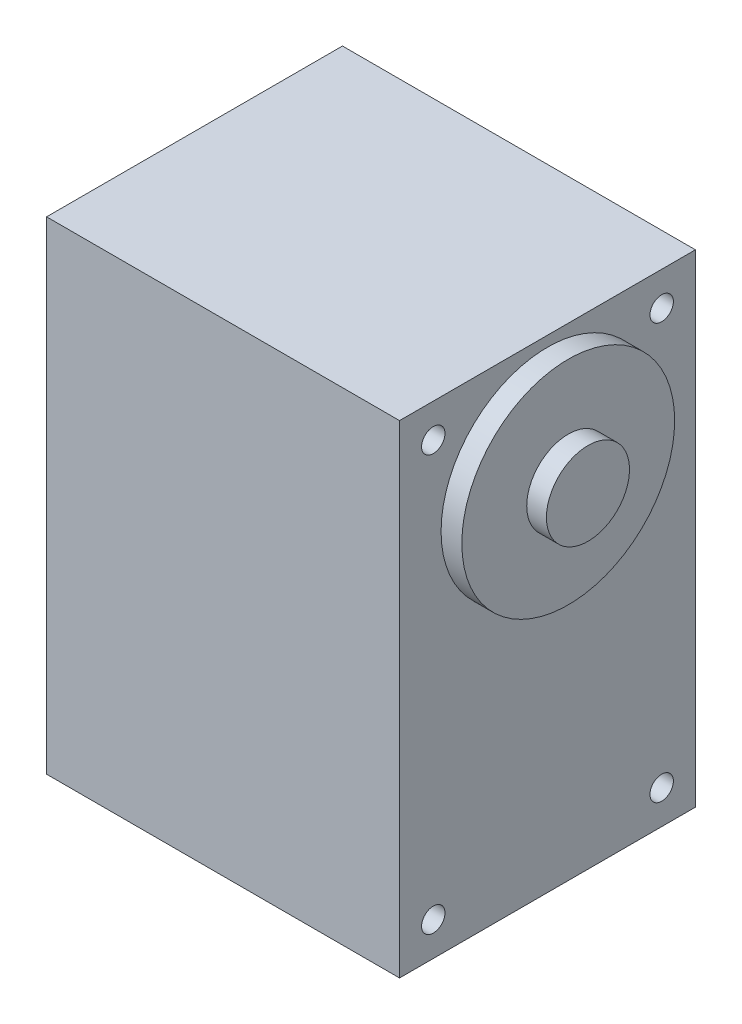
ISO-10303-21;
HEADER;
FILE_DESCRIPTION(('STEP AP214'),'2;1');
FILE_NAME('part.step','',(''),(''),'','','');
FILE_SCHEMA(('AUTOMOTIVE_DESIGN { 1 0 10303 214 1 1 1 1 }'));
ENDSEC;
DATA;
#1=APPLICATION_CONTEXT('core data for automotive mechanical design processes');
#2=APPLICATION_PROTOCOL_DEFINITION('international standard','automotive_design',2000,#1);
#3=PRODUCT_CONTEXT('',#1,'mechanical');
#4=PRODUCT('Part','Part','',(#3));
#5=PRODUCT_RELATED_PRODUCT_CATEGORY('part','',(#4));
#6=PRODUCT_DEFINITION_FORMATION('','',#4);
#7=PRODUCT_DEFINITION_CONTEXT('part definition',#1,'design');
#8=PRODUCT_DEFINITION('design','',#6,#7);
#9=PRODUCT_DEFINITION_SHAPE('','',#8);
#10=(LENGTH_UNIT() NAMED_UNIT(*) SI_UNIT(.MILLI.,.METRE.));
#11=(NAMED_UNIT(*) PLANE_ANGLE_UNIT() SI_UNIT($,.RADIAN.));
#12=(NAMED_UNIT(*) SI_UNIT($,.STERADIAN.) SOLID_ANGLE_UNIT());
#13=UNCERTAINTY_MEASURE_WITH_UNIT(LENGTH_MEASURE(1.E-05),#10,'distance_accuracy_value','');
#14=(GEOMETRIC_REPRESENTATION_CONTEXT(3) GLOBAL_UNCERTAINTY_ASSIGNED_CONTEXT((#13)) GLOBAL_UNIT_ASSIGNED_CONTEXT((#10,
#11,#12)) REPRESENTATION_CONTEXT('',''));
#15=CARTESIAN_POINT('',(0.,0.,0.));
#16=DIRECTION('',(0.,0.,1.));
#17=DIRECTION('',(1.,0.,0.));
#18=AXIS2_PLACEMENT_3D('',#15,#16,#17);
#19=CARTESIAN_POINT('',(17.,-23.25,28.5));
#20=DIRECTION('',(-1.,0.,0.));
#21=DIRECTION('',(0.,0.,1.));
#22=AXIS2_PLACEMENT_3D('',#19,#20,#21);
#23=PLANE('',#22);
#24=CARTESIAN_POINT('',(17.,-20.,3.24999999999958));
#25=DIRECTION('',(1.,0.,0.));
#26=DIRECTION('',(0.,0.,-1.));
#27=AXIS2_PLACEMENT_3D('',#24,#25,#26);
#28=CIRCLE('',#27,1.12689016254773);
#29=CARTESIAN_POINT('',(17.,-20.,2.12310983745185));
#30=VERTEX_POINT('',#29);
#31=EDGE_CURVE('E127',#30,#30,#28,.T.);
#32=ORIENTED_EDGE('',*,*,#31,.F.);
#33=EDGE_LOOP('',(#32));
#34=FACE_BOUND('',#33,.T.);
#35=CARTESIAN_POINT('',(17.,-20.0000000000002,25.2499999999995));
#36=DIRECTION('',(1.,0.,0.));
#37=DIRECTION('',(0.,0.,-1.));
#38=AXIS2_PLACEMENT_3D('',#35,#36,#37);
#39=CIRCLE('',#38,1.12689016254773);
#40=CARTESIAN_POINT('',(17.,-20.0000000000002,24.1231098374517));
#41=VERTEX_POINT('',#40);
#42=EDGE_CURVE('E134',#41,#41,#39,.T.);
#43=ORIENTED_EDGE('',*,*,#42,.F.);
#44=EDGE_LOOP('',(#43));
#45=FACE_BOUND('',#44,.T.);
#46=CARTESIAN_POINT('',(17.,19.9999999999999,25.2499999999999));
#47=DIRECTION('',(1.,0.,0.));
#48=DIRECTION('',(0.,0.,-1.));
#49=AXIS2_PLACEMENT_3D('',#46,#47,#48);
#50=CIRCLE('',#49,1.12689016254773);
#51=CARTESIAN_POINT('',(17.,19.9999999999999,24.1231098374522));
#52=VERTEX_POINT('',#51);
#53=EDGE_CURVE('E140',#52,#52,#50,.T.);
#54=ORIENTED_EDGE('',*,*,#53,.F.);
#55=EDGE_LOOP('',(#54));
#56=FACE_BOUND('',#55,.T.);
#57=CARTESIAN_POINT('',(17.,20.0000000000001,3.25));
#58=DIRECTION('',(1.,0.,0.));
#59=DIRECTION('',(0.,0.,-1.));
#60=AXIS2_PLACEMENT_3D('',#57,#58,#59);
#61=CIRCLE('',#60,1.12689016254773);
#62=CARTESIAN_POINT('',(17.,20.0000000000001,2.12310983745227));
#63=VERTEX_POINT('',#62);
#64=EDGE_CURVE('E121',#63,#63,#61,.T.);
#65=ORIENTED_EDGE('',*,*,#64,.F.);
#66=EDGE_LOOP('',(#65));
#67=FACE_BOUND('',#66,.T.);
#68=CARTESIAN_POINT('',(17.,12.,14.25));
#69=DIRECTION('',(1.,0.,0.));
#70=DIRECTION('',(0.,0.,-1.));
#71=AXIS2_PLACEMENT_3D('',#68,#69,#70);
#72=CIRCLE('',#71,10.25);
#73=CARTESIAN_POINT('',(17.,12.,4.));
#74=VERTEX_POINT('',#73);
#75=EDGE_CURVE('E41',#74,#74,#72,.T.);
#76=ORIENTED_EDGE('',*,*,#75,.F.);
#77=EDGE_LOOP('',(#76));
#78=FACE_BOUND('',#77,.T.);
#79=DIRECTION('',(0.,1.,0.));
#80=VECTOR('',#79,1.);
#81=CARTESIAN_POINT('',(17.,-23.25,0.));
#82=LINE('',#81,#80);
#83=CARTESIAN_POINT('',(17.,-23.25,0.));
#84=VERTEX_POINT('',#83);
#85=CARTESIAN_POINT('',(17.,23.25,0.));
#86=VERTEX_POINT('',#85);
#87=EDGE_CURVE('E99',#84,#86,#82,.T.);
#88=ORIENTED_EDGE('',*,*,#87,.T.);
#89=DIRECTION('',(0.,0.,-1.));
#90=VECTOR('',#89,1.);
#91=CARTESIAN_POINT('',(17.,23.25,28.5));
#92=LINE('',#91,#90);
#93=CARTESIAN_POINT('',(17.,23.25,28.5));
#94=VERTEX_POINT('',#93);
#95=EDGE_CURVE('E35',#94,#86,#92,.T.);
#96=ORIENTED_EDGE('',*,*,#95,.F.);
#97=DIRECTION('',(0.,1.,0.));
#98=VECTOR('',#97,1.);
#99=CARTESIAN_POINT('',(17.,-23.25,28.5));
#100=LINE('',#99,#98);
#101=CARTESIAN_POINT('',(17.,-23.25,28.5));
#102=VERTEX_POINT('',#101);
#103=EDGE_CURVE('E86',#102,#94,#100,.T.);
#104=ORIENTED_EDGE('',*,*,#103,.F.);
#105=DIRECTION('',(0.,0.,-1.));
#106=VECTOR('',#105,1.);
#107=CARTESIAN_POINT('',(17.,-23.25,28.5));
#108=LINE('',#107,#106);
#109=EDGE_CURVE('E95',#102,#84,#108,.T.);
#110=ORIENTED_EDGE('',*,*,#109,.T.);
#111=EDGE_LOOP('',(#88,#96,#104,#110));
#112=FACE_BOUND('',#111,.T.);
#113=ADVANCED_FACE('F32',(#34,#45,#56,#67,#78,#112),#23,.F.);
#114=CARTESIAN_POINT('',(-17.,23.25,28.5));
#115=DIRECTION('',(0.,-1.,0.));
#116=DIRECTION('',(0.,0.,-1.));
#117=AXIS2_PLACEMENT_3D('',#114,#115,#116);
#118=PLANE('',#117);
#119=DIRECTION('',(-1.,0.,0.));
#120=VECTOR('',#119,1.);
#121=CARTESIAN_POINT('',(-17.,23.25,0.));
#122=LINE('',#121,#120);
#123=CARTESIAN_POINT('',(-17.,23.25,0.));
#124=VERTEX_POINT('',#123);
#125=EDGE_CURVE('E91',#86,#124,#122,.T.);
#126=ORIENTED_EDGE('',*,*,#125,.T.);
#127=DIRECTION('',(0.,0.,-1.));
#128=VECTOR('',#127,1.);
#129=CARTESIAN_POINT('',(-17.,23.25,28.5));
#130=LINE('',#129,#128);
#131=CARTESIAN_POINT('',(-17.,23.25,28.5));
#132=VERTEX_POINT('',#131);
#133=EDGE_CURVE('E89',#132,#124,#130,.T.);
#134=ORIENTED_EDGE('',*,*,#133,.F.);
#135=DIRECTION('',(-1.,0.,0.));
#136=VECTOR('',#135,1.);
#137=CARTESIAN_POINT('',(-17.,23.25,28.5));
#138=LINE('',#137,#136);
#139=EDGE_CURVE('E81',#94,#132,#138,.T.);
#140=ORIENTED_EDGE('',*,*,#139,.F.);
#141=ORIENTED_EDGE('',*,*,#95,.T.);
#142=EDGE_LOOP('',(#126,#134,#140,#141));
#143=FACE_BOUND('',#142,.T.);
#144=ADVANCED_FACE('F90',(#143),#118,.F.);
#145=CARTESIAN_POINT('',(-17.,-23.25,28.5));
#146=DIRECTION('',(1.,0.,0.));
#147=DIRECTION('',(0.,0.,-1.));
#148=AXIS2_PLACEMENT_3D('',#145,#146,#147);
#149=PLANE('',#148);
#150=CARTESIAN_POINT('',(-17.,-20.,3.24999999999958));
#151=DIRECTION('',(1.,0.,0.));
#152=DIRECTION('',(0.,0.,-1.));
#153=AXIS2_PLACEMENT_3D('',#150,#151,#152);
#154=CIRCLE('',#153,1.12689016254773);
#155=CARTESIAN_POINT('',(-17.,-20.,2.12310983745185));
#156=VERTEX_POINT('',#155);
#157=EDGE_CURVE('E151',#156,#156,#154,.T.);
#158=ORIENTED_EDGE('',*,*,#157,.T.);
#159=EDGE_LOOP('',(#158));
#160=FACE_BOUND('',#159,.T.);
#161=CARTESIAN_POINT('',(-17.,-20.0000000000002,25.2499999999995));
#162=DIRECTION('',(1.,0.,0.));
#163=DIRECTION('',(0.,0.,-1.));
#164=AXIS2_PLACEMENT_3D('',#161,#162,#163);
#165=CIRCLE('',#164,1.12689016254773);
#166=CARTESIAN_POINT('',(-17.,-20.0000000000002,24.1231098374517));
#167=VERTEX_POINT('',#166);
#168=EDGE_CURVE('E157',#167,#167,#165,.T.);
#169=ORIENTED_EDGE('',*,*,#168,.T.);
#170=EDGE_LOOP('',(#169));
#171=FACE_BOUND('',#170,.T.);
#172=CARTESIAN_POINT('',(-17.,19.9999999999999,25.2499999999999));
#173=DIRECTION('',(1.,0.,0.));
#174=DIRECTION('',(0.,0.,-1.));
#175=AXIS2_PLACEMENT_3D('',#172,#173,#174);
#176=CIRCLE('',#175,1.12689016254773);
#177=CARTESIAN_POINT('',(-17.,19.9999999999999,24.1231098374522));
#178=VERTEX_POINT('',#177);
#179=EDGE_CURVE('E163',#178,#178,#176,.T.);
#180=ORIENTED_EDGE('',*,*,#179,.T.);
#181=EDGE_LOOP('',(#180));
#182=FACE_BOUND('',#181,.T.);
#183=CARTESIAN_POINT('',(-17.,20.0000000000001,3.25));
#184=DIRECTION('',(1.,0.,0.));
#185=DIRECTION('',(0.,0.,-1.));
#186=AXIS2_PLACEMENT_3D('',#183,#184,#185);
#187=CIRCLE('',#186,1.12689016254773);
#188=CARTESIAN_POINT('',(-17.,20.0000000000001,2.12310983745227));
#189=VERTEX_POINT('',#188);
#190=EDGE_CURVE('E145',#189,#189,#187,.T.);
#191=ORIENTED_EDGE('',*,*,#190,.T.);
#192=EDGE_LOOP('',(#191));
#193=FACE_BOUND('',#192,.T.);
#194=DIRECTION('',(0.,-1.,0.));
#195=VECTOR('',#194,1.);
#196=CARTESIAN_POINT('',(-17.,-23.25,0.));
#197=LINE('',#196,#195);
#198=CARTESIAN_POINT('',(-17.,-23.25,0.));
#199=VERTEX_POINT('',#198);
#200=EDGE_CURVE('E67',#124,#199,#197,.T.);
#201=ORIENTED_EDGE('',*,*,#200,.T.);
#202=DIRECTION('',(0.,0.,-1.));
#203=VECTOR('',#202,1.);
#204=CARTESIAN_POINT('',(-17.,-23.25,28.5));
#205=LINE('',#204,#203);
#206=CARTESIAN_POINT('',(-17.,-23.25,28.5));
#207=VERTEX_POINT('',#206);
#208=EDGE_CURVE('E92',#207,#199,#205,.T.);
#209=ORIENTED_EDGE('',*,*,#208,.F.);
#210=DIRECTION('',(0.,-1.,0.));
#211=VECTOR('',#210,1.);
#212=CARTESIAN_POINT('',(-17.,-23.25,28.5));
#213=LINE('',#212,#211);
#214=EDGE_CURVE('E84',#132,#207,#213,.T.);
#215=ORIENTED_EDGE('',*,*,#214,.F.);
#216=ORIENTED_EDGE('',*,*,#133,.T.);
#217=EDGE_LOOP('',(#201,#209,#215,#216));
#218=FACE_BOUND('',#217,.T.);
#219=ADVANCED_FACE('F93',(#160,#171,#182,#193,#218),#149,.F.);
#220=CARTESIAN_POINT('',(-17.,-23.25,28.5));
#221=DIRECTION('',(0.,1.,0.));
#222=DIRECTION('',(0.,0.,1.));
#223=AXIS2_PLACEMENT_3D('',#220,#221,#222);
#224=PLANE('',#223);
#225=DIRECTION('',(1.,0.,0.));
#226=VECTOR('',#225,1.);
#227=CARTESIAN_POINT('',(-17.,-23.25,0.));
#228=LINE('',#227,#226);
#229=EDGE_CURVE('E73',#199,#84,#228,.T.);
#230=ORIENTED_EDGE('',*,*,#229,.T.);
#231=ORIENTED_EDGE('',*,*,#109,.F.);
#232=DIRECTION('',(1.,0.,0.));
#233=VECTOR('',#232,1.);
#234=CARTESIAN_POINT('',(-17.,-23.25,28.5));
#235=LINE('',#234,#233);
#236=EDGE_CURVE('E50',#207,#102,#235,.T.);
#237=ORIENTED_EDGE('',*,*,#236,.F.);
#238=ORIENTED_EDGE('',*,*,#208,.T.);
#239=EDGE_LOOP('',(#230,#231,#237,#238));
#240=FACE_BOUND('',#239,.T.);
#241=ADVANCED_FACE('F107',(#240),#224,.F.);
#242=CARTESIAN_POINT('',(0.,0.,28.5));
#243=DIRECTION('',(0.,0.,-1.));
#244=DIRECTION('',(-1.,0.,0.));
#245=AXIS2_PLACEMENT_3D('',#242,#243,#244);
#246=PLANE('',#245);
#247=ORIENTED_EDGE('',*,*,#103,.T.);
#248=ORIENTED_EDGE('',*,*,#139,.T.);
#249=ORIENTED_EDGE('',*,*,#214,.T.);
#250=ORIENTED_EDGE('',*,*,#236,.T.);
#251=EDGE_LOOP('',(#247,#248,#249,#250));
#252=FACE_BOUND('',#251,.T.);
#253=ADVANCED_FACE('F82',(#252),#246,.F.);
#254=CARTESIAN_POINT('',(0.,0.,0.));
#255=DIRECTION('',(0.,0.,-1.));
#256=DIRECTION('',(-1.,0.,0.));
#257=AXIS2_PLACEMENT_3D('',#254,#255,#256);
#258=PLANE('',#257);
#259=ORIENTED_EDGE('',*,*,#87,.F.);
#260=ORIENTED_EDGE('',*,*,#229,.F.);
#261=ORIENTED_EDGE('',*,*,#200,.F.);
#262=ORIENTED_EDGE('',*,*,#125,.F.);
#263=EDGE_LOOP('',(#259,#260,#261,#262));
#264=FACE_BOUND('',#263,.T.);
#265=ADVANCED_FACE('F110',(#264),#258,.T.);
#266=CARTESIAN_POINT('',(19.,12.,14.25));
#267=DIRECTION('',(-1.,0.,0.));
#268=DIRECTION('',(0.,0.,1.));
#269=AXIS2_PLACEMENT_3D('',#266,#267,#268);
#270=CYLINDRICAL_SURFACE('',#269,10.25);
#271=CARTESIAN_POINT('',(19.,12.,14.25));
#272=DIRECTION('',(1.,0.,0.));
#273=DIRECTION('',(0.,0.,-1.));
#274=AXIS2_PLACEMENT_3D('',#271,#272,#273);
#275=CIRCLE('',#274,10.25);
#276=CARTESIAN_POINT('',(19.,12.,4.));
#277=VERTEX_POINT('',#276);
#278=EDGE_CURVE('E102',#277,#277,#275,.T.);
#279=ORIENTED_EDGE('',*,*,#278,.F.);
#280=EDGE_LOOP('',(#279));
#281=FACE_BOUND('',#280,.T.);
#282=ORIENTED_EDGE('',*,*,#75,.T.);
#283=EDGE_LOOP('',(#282));
#284=FACE_BOUND('',#283,.T.);
#285=ADVANCED_FACE('F200',(#281,#284),#270,.T.);
#286=CARTESIAN_POINT('',(19.,12.,14.25));
#287=DIRECTION('',(1.,0.,0.));
#288=DIRECTION('',(0.,0.,-1.));
#289=AXIS2_PLACEMENT_3D('',#286,#287,#288);
#290=PLANE('',#289);
#291=CARTESIAN_POINT('',(19.,12.,14.25));
#292=DIRECTION('',(1.,0.,0.));
#293=DIRECTION('',(0.,0.,-1.));
#294=AXIS2_PLACEMENT_3D('',#291,#292,#293);
#295=CIRCLE('',#294,4.);
#296=CARTESIAN_POINT('',(19.,12.,18.25));
#297=VERTEX_POINT('',#296);
#298=EDGE_CURVE('E11',#297,#297,#295,.T.);
#299=ORIENTED_EDGE('',*,*,#298,.F.);
#300=EDGE_LOOP('',(#299));
#301=FACE_BOUND('',#300,.T.);
#302=ORIENTED_EDGE('',*,*,#278,.T.);
#303=EDGE_LOOP('',(#302));
#304=FACE_BOUND('',#303,.T.);
#305=ADVANCED_FACE('F202',(#301,#304),#290,.T.);
#306=CARTESIAN_POINT('',(20.9,12.,14.25));
#307=DIRECTION('',(-1.,0.,0.));
#308=DIRECTION('',(0.,0.,1.));
#309=AXIS2_PLACEMENT_3D('',#306,#307,#308);
#310=CYLINDRICAL_SURFACE('',#309,4.);
#311=CARTESIAN_POINT('',(20.9,12.,14.25));
#312=DIRECTION('',(1.,0.,0.));
#313=DIRECTION('',(0.,0.,-1.));
#314=AXIS2_PLACEMENT_3D('',#311,#312,#313);
#315=CIRCLE('',#314,4.);
#316=CARTESIAN_POINT('',(20.9,12.,18.25));
#317=VERTEX_POINT('',#316);
#318=EDGE_CURVE('E116',#317,#317,#315,.T.);
#319=CARTESIAN_POINT('',(20.9,12.,18.25));
#320=CARTESIAN_POINT('',(20.8802083333333,12.,18.25));
#321=CARTESIAN_POINT('',(20.8604166666667,12.,18.25));
#322=CARTESIAN_POINT('',(20.8208333333333,12.,18.25));
#323=CARTESIAN_POINT('',(20.8010416666667,12.,18.25));
#324=CARTESIAN_POINT('',(20.7614583333333,12.,18.25));
#325=CARTESIAN_POINT('',(20.7416666666667,12.,18.25));
#326=CARTESIAN_POINT('',(20.7020833333333,12.,18.25));
#327=CARTESIAN_POINT('',(20.6822916666667,12.,18.25));
#328=CARTESIAN_POINT('',(20.6427083333333,12.,18.25));
#329=CARTESIAN_POINT('',(20.6229166666667,12.,18.25));
#330=CARTESIAN_POINT('',(20.5833333333333,12.,18.25));
#331=CARTESIAN_POINT('',(20.5635416666667,12.,18.25));
#332=CARTESIAN_POINT('',(20.5239583333333,12.,18.25));
#333=CARTESIAN_POINT('',(20.5041666666667,12.,18.25));
#334=CARTESIAN_POINT('',(20.4645833333333,12.,18.25));
#335=CARTESIAN_POINT('',(20.4447916666667,12.,18.25));
#336=CARTESIAN_POINT('',(20.4052083333333,12.,18.25));
#337=CARTESIAN_POINT('',(20.3854166666667,12.,18.25));
#338=CARTESIAN_POINT('',(20.3458333333333,12.,18.25));
#339=CARTESIAN_POINT('',(20.3260416666667,12.,18.25));
#340=CARTESIAN_POINT('',(20.2864583333333,12.,18.25));
#341=CARTESIAN_POINT('',(20.2666666666667,12.,18.25));
#342=CARTESIAN_POINT('',(20.2270833333333,12.,18.25));
#343=CARTESIAN_POINT('',(20.2072916666667,12.,18.25));
#344=CARTESIAN_POINT('',(20.1677083333333,12.,18.25));
#345=CARTESIAN_POINT('',(20.1479166666667,12.,18.25));
#346=CARTESIAN_POINT('',(20.1083333333333,12.,18.25));
#347=CARTESIAN_POINT('',(20.0885416666667,12.,18.25));
#348=CARTESIAN_POINT('',(20.0489583333333,12.,18.25));
#349=CARTESIAN_POINT('',(20.0291666666667,12.,18.25));
#350=CARTESIAN_POINT('',(19.9895833333333,12.,18.25));
#351=CARTESIAN_POINT('',(19.9697916666667,12.,18.25));
#352=CARTESIAN_POINT('',(19.9302083333333,12.,18.25));
#353=CARTESIAN_POINT('',(19.9104166666667,12.,18.25));
#354=CARTESIAN_POINT('',(19.8708333333333,12.,18.25));
#355=CARTESIAN_POINT('',(19.8510416666667,12.,18.25));
#356=CARTESIAN_POINT('',(19.8114583333333,12.,18.25));
#357=CARTESIAN_POINT('',(19.7916666666667,12.,18.25));
#358=CARTESIAN_POINT('',(19.7520833333333,12.,18.25));
#359=CARTESIAN_POINT('',(19.7322916666667,12.,18.25));
#360=CARTESIAN_POINT('',(19.6927083333333,12.,18.25));
#361=CARTESIAN_POINT('',(19.6729166666667,12.,18.25));
#362=CARTESIAN_POINT('',(19.6333333333333,12.,18.25));
#363=CARTESIAN_POINT('',(19.6135416666667,12.,18.25));
#364=CARTESIAN_POINT('',(19.5739583333333,12.,18.25));
#365=CARTESIAN_POINT('',(19.5541666666667,12.,18.25));
#366=CARTESIAN_POINT('',(19.5145833333333,12.,18.25));
#367=CARTESIAN_POINT('',(19.4947916666667,12.,18.25));
#368=CARTESIAN_POINT('',(19.4552083333333,12.,18.25));
#369=CARTESIAN_POINT('',(19.4354166666667,12.,18.25));
#370=CARTESIAN_POINT('',(19.3958333333333,12.,18.25));
#371=CARTESIAN_POINT('',(19.3760416666667,12.,18.25));
#372=CARTESIAN_POINT('',(19.3364583333333,12.,18.25));
#373=CARTESIAN_POINT('',(19.3166666666667,12.,18.25));
#374=CARTESIAN_POINT('',(19.2770833333333,12.,18.25));
#375=CARTESIAN_POINT('',(19.2572916666667,12.,18.25));
#376=CARTESIAN_POINT('',(19.2177083333333,12.,18.25));
#377=CARTESIAN_POINT('',(19.1979166666667,12.,18.25));
#378=CARTESIAN_POINT('',(19.1583333333333,12.,18.25));
#379=CARTESIAN_POINT('',(19.1385416666667,12.,18.25));
#380=CARTESIAN_POINT('',(19.0989583333333,12.,18.25));
#381=CARTESIAN_POINT('',(19.0791666666667,12.,18.25));
#382=CARTESIAN_POINT('',(19.0395833333333,12.,18.25));
#383=CARTESIAN_POINT('',(19.0197916666667,12.,18.25));
#384=CARTESIAN_POINT('',(19.,12.,18.25));
#385=B_SPLINE_CURVE_WITH_KNOTS('',3,(#319,#320,#321,#322,#323,#324,#325,#326,#327,#328,#329,
#330,#331,#332,#333,#334,#335,#336,#337,#338,#339,#340,#341,#342,#343,#344,#345,#346,#347,#348,
#349,#350,#351,#352,#353,#354,#355,#356,#357,#358,#359,#360,#361,#362,#363,#364,#365,#366,#367,
#368,#369,#370,#371,#372,#373,#374,#375,#376,#377,#378,#379,#380,#381,#382,#383,#384),
.UNSPECIFIED.,.F.,.F.,(4,2,2,2,2,2,2,2,2,2,2,2,2,2,2,2,2,2,2,2,2,2,2,2,2,2,2,2,2,2,2,2,4),(0.,
0.0593749999999969,0.118749999999997,0.178124999999998,0.237499999999998,0.296874999999999,
0.356249999999999,0.415624999999999,0.475,0.534374999999997,0.593749999999997,0.653124999999998,
0.712499999999998,0.771874999999998,0.831249999999999,0.890624999999999,0.95,1.009375,1.06875,
1.128125,1.1875,1.246875,1.30625,1.365625,1.425,1.484375,1.54375,1.603125,1.6625,1.721875,
1.78125,1.840625,1.9),.UNSPECIFIED.);
#386=EDGE_CURVE('BSEAM209',#317,#297,#385,.T.);
#387=ORIENTED_EDGE('',*,*,#318,.F.);
#388=ORIENTED_EDGE('',*,*,#298,.T.);
#389=ORIENTED_EDGE('',*,*,#386,.T.);
#390=ORIENTED_EDGE('',*,*,#386,.F.);
#391=EDGE_LOOP('',(#387,#389,#388,#390));
#392=FACE_BOUND('',#391,.T.);
#393=ADVANCED_FACE('F209',(#392),#310,.T.);
#394=CARTESIAN_POINT('',(20.9,12.,14.25));
#395=DIRECTION('',(1.,0.,0.));
#396=DIRECTION('',(0.,0.,-1.));
#397=AXIS2_PLACEMENT_3D('',#394,#395,#396);
#398=PLANE('',#397);
#399=ORIENTED_EDGE('',*,*,#318,.T.);
#400=EDGE_LOOP('',(#399));
#401=FACE_BOUND('',#400,.T.);
#402=ADVANCED_FACE('F274',(#401),#398,.T.);
#403=CARTESIAN_POINT('',(13.,20.0000000000001,3.25));
#404=DIRECTION('',(1.,0.,0.));
#405=DIRECTION('',(0.,0.,-1.));
#406=AXIS2_PLACEMENT_3D('',#403,#404,#405);
#407=CYLINDRICAL_SURFACE('',#406,1.12689016254773);
#408=CARTESIAN_POINT('',(13.,20.0000000000001,3.25));
#409=DIRECTION('',(1.,0.,0.));
#410=DIRECTION('',(0.,0.,-1.));
#411=AXIS2_PLACEMENT_3D('',#408,#409,#410);
#412=CIRCLE('',#411,1.12689016254773);
#413=CARTESIAN_POINT('',(13.,20.0000000000001,2.12310983745227));
#414=VERTEX_POINT('',#413);
#415=EDGE_CURVE('E120',#414,#414,#412,.T.);
#416=ORIENTED_EDGE('',*,*,#415,.F.);
#417=EDGE_LOOP('',(#416));
#418=FACE_BOUND('',#417,.T.);
#419=ORIENTED_EDGE('',*,*,#64,.T.);
#420=EDGE_LOOP('',(#419));
#421=FACE_BOUND('',#420,.T.);
#422=ADVANCED_FACE('F270',(#418,#421),#407,.F.);
#423=CARTESIAN_POINT('',(13.,20.0000000000001,3.25));
#424=DIRECTION('',(1.,0.,0.));
#425=DIRECTION('',(0.,0.,-1.));
#426=AXIS2_PLACEMENT_3D('',#423,#424,#425);
#427=PLANE('',#426);
#428=ORIENTED_EDGE('',*,*,#415,.T.);
#429=EDGE_LOOP('',(#428));
#430=FACE_BOUND('',#429,.T.);
#431=ADVANCED_FACE('F256',(#430),#427,.T.);
#432=CARTESIAN_POINT('',(13.,19.9999999999999,25.2499999999999));
#433=DIRECTION('',(1.,0.,0.));
#434=DIRECTION('',(0.,0.,-1.));
#435=AXIS2_PLACEMENT_3D('',#432,#433,#434);
#436=CYLINDRICAL_SURFACE('',#435,1.12689016254773);
#437=CARTESIAN_POINT('',(13.,19.9999999999999,25.2499999999999));
#438=DIRECTION('',(1.,0.,0.));
#439=DIRECTION('',(0.,0.,-1.));
#440=AXIS2_PLACEMENT_3D('',#437,#438,#439);
#441=CIRCLE('',#440,1.12689016254773);
#442=CARTESIAN_POINT('',(13.,19.9999999999999,24.1231098374522));
#443=VERTEX_POINT('',#442);
#444=EDGE_CURVE('E124',#443,#443,#441,.T.);
#445=ORIENTED_EDGE('',*,*,#444,.F.);
#446=EDGE_LOOP('',(#445));
#447=FACE_BOUND('',#446,.T.);
#448=ORIENTED_EDGE('',*,*,#53,.T.);
#449=EDGE_LOOP('',(#448));
#450=FACE_BOUND('',#449,.T.);
#451=ADVANCED_FACE('F252',(#447,#450),#436,.F.);
#452=CARTESIAN_POINT('',(13.,19.9999999999999,25.2499999999999));
#453=DIRECTION('',(1.,0.,0.));
#454=DIRECTION('',(0.,0.,-1.));
#455=AXIS2_PLACEMENT_3D('',#452,#453,#454);
#456=PLANE('',#455);
#457=ORIENTED_EDGE('',*,*,#444,.T.);
#458=EDGE_LOOP('',(#457));
#459=FACE_BOUND('',#458,.T.);
#460=ADVANCED_FACE('F248',(#459),#456,.T.);
#461=CARTESIAN_POINT('',(13.,-20.0000000000002,25.2499999999995));
#462=DIRECTION('',(1.,0.,0.));
#463=DIRECTION('',(0.,0.,-1.));
#464=AXIS2_PLACEMENT_3D('',#461,#462,#463);
#465=CYLINDRICAL_SURFACE('',#464,1.12689016254773);
#466=CARTESIAN_POINT('',(13.,-20.0000000000002,25.2499999999995));
#467=DIRECTION('',(1.,0.,0.));
#468=DIRECTION('',(0.,0.,-1.));
#469=AXIS2_PLACEMENT_3D('',#466,#467,#468);
#470=CIRCLE('',#469,1.12689016254773);
#471=CARTESIAN_POINT('',(13.,-20.0000000000002,24.1231098374517));
#472=VERTEX_POINT('',#471);
#473=EDGE_CURVE('E137',#472,#472,#470,.T.);
#474=ORIENTED_EDGE('',*,*,#473,.F.);
#475=EDGE_LOOP('',(#474));
#476=FACE_BOUND('',#475,.T.);
#477=ORIENTED_EDGE('',*,*,#42,.T.);
#478=EDGE_LOOP('',(#477));
#479=FACE_BOUND('',#478,.T.);
#480=ADVANCED_FACE('F251',(#476,#479),#465,.F.);
#481=CARTESIAN_POINT('',(13.,-20.0000000000002,25.2499999999995));
#482=DIRECTION('',(1.,0.,0.));
#483=DIRECTION('',(0.,0.,-1.));
#484=AXIS2_PLACEMENT_3D('',#481,#482,#483);
#485=PLANE('',#484);
#486=ORIENTED_EDGE('',*,*,#473,.T.);
#487=EDGE_LOOP('',(#486));
#488=FACE_BOUND('',#487,.T.);
#489=ADVANCED_FACE('F258',(#488),#485,.T.);
#490=CARTESIAN_POINT('',(13.,-20.,3.24999999999958));
#491=DIRECTION('',(1.,0.,0.));
#492=DIRECTION('',(0.,0.,-1.));
#493=AXIS2_PLACEMENT_3D('',#490,#491,#492);
#494=CYLINDRICAL_SURFACE('',#493,1.12689016254773);
#495=CARTESIAN_POINT('',(13.,-20.,3.24999999999958));
#496=DIRECTION('',(1.,0.,0.));
#497=DIRECTION('',(0.,0.,-1.));
#498=AXIS2_PLACEMENT_3D('',#495,#496,#497);
#499=CIRCLE('',#498,1.12689016254773);
#500=CARTESIAN_POINT('',(13.,-20.,2.12310983745185));
#501=VERTEX_POINT('',#500);
#502=EDGE_CURVE('E130',#501,#501,#499,.T.);
#503=ORIENTED_EDGE('',*,*,#502,.F.);
#504=EDGE_LOOP('',(#503));
#505=FACE_BOUND('',#504,.T.);
#506=ORIENTED_EDGE('',*,*,#31,.T.);
#507=EDGE_LOOP('',(#506));
#508=FACE_BOUND('',#507,.T.);
#509=ADVANCED_FACE('F243',(#505,#508),#494,.F.);
#510=CARTESIAN_POINT('',(13.,-20.,3.24999999999958));
#511=DIRECTION('',(1.,0.,0.));
#512=DIRECTION('',(0.,0.,-1.));
#513=AXIS2_PLACEMENT_3D('',#510,#511,#512);
#514=PLANE('',#513);
#515=ORIENTED_EDGE('',*,*,#502,.T.);
#516=EDGE_LOOP('',(#515));
#517=FACE_BOUND('',#516,.T.);
#518=ADVANCED_FACE('F234',(#517),#514,.T.);
#519=CARTESIAN_POINT('',(-13.,20.0000000000001,3.25));
#520=DIRECTION('',(-1.,0.,0.));
#521=DIRECTION('',(0.,0.,1.));
#522=AXIS2_PLACEMENT_3D('',#519,#520,#521);
#523=CYLINDRICAL_SURFACE('',#522,1.12689016254773);
#524=CARTESIAN_POINT('',(-13.,20.0000000000001,3.25));
#525=DIRECTION('',(1.,0.,0.));
#526=DIRECTION('',(0.,0.,-1.));
#527=AXIS2_PLACEMENT_3D('',#524,#525,#526);
#528=CIRCLE('',#527,1.12689016254773);
#529=CARTESIAN_POINT('',(-13.,20.0000000000001,2.12310983745227));
#530=VERTEX_POINT('',#529);
#531=EDGE_CURVE('E131',#530,#530,#528,.T.);
#532=ORIENTED_EDGE('',*,*,#531,.T.);
#533=EDGE_LOOP('',(#532));
#534=FACE_BOUND('',#533,.T.);
#535=ORIENTED_EDGE('',*,*,#190,.F.);
#536=EDGE_LOOP('',(#535));
#537=FACE_BOUND('',#536,.T.);
#538=ADVANCED_FACE('F232',(#534,#537),#523,.F.);
#539=CARTESIAN_POINT('',(-13.,20.0000000000001,3.25));
#540=DIRECTION('',(-1.,0.,0.));
#541=DIRECTION('',(0.,0.,-1.));
#542=AXIS2_PLACEMENT_3D('',#539,#540,#541);
#543=PLANE('',#542);
#544=ORIENTED_EDGE('',*,*,#531,.F.);
#545=EDGE_LOOP('',(#544));
#546=FACE_BOUND('',#545,.T.);
#547=ADVANCED_FACE('F183',(#546),#543,.T.);
#548=CARTESIAN_POINT('',(-13.,19.9999999999999,25.2499999999999));
#549=DIRECTION('',(-1.,0.,0.));
#550=DIRECTION('',(0.,0.,1.));
#551=AXIS2_PLACEMENT_3D('',#548,#549,#550);
#552=CYLINDRICAL_SURFACE('',#551,1.12689016254773);
#553=CARTESIAN_POINT('',(-13.,19.9999999999999,25.2499999999999));
#554=DIRECTION('',(1.,0.,0.));
#555=DIRECTION('',(0.,0.,-1.));
#556=AXIS2_PLACEMENT_3D('',#553,#554,#555);
#557=CIRCLE('',#556,1.12689016254773);
#558=CARTESIAN_POINT('',(-13.,19.9999999999999,24.1231098374522));
#559=VERTEX_POINT('',#558);
#560=EDGE_CURVE('E148',#559,#559,#557,.T.);
#561=ORIENTED_EDGE('',*,*,#560,.T.);
#562=EDGE_LOOP('',(#561));
#563=FACE_BOUND('',#562,.T.);
#564=ORIENTED_EDGE('',*,*,#179,.F.);
#565=EDGE_LOOP('',(#564));
#566=FACE_BOUND('',#565,.T.);
#567=ADVANCED_FACE('F169',(#563,#566),#552,.F.);
#568=CARTESIAN_POINT('',(-13.,19.9999999999999,25.2499999999999));
#569=DIRECTION('',(-1.,0.,0.));
#570=DIRECTION('',(0.,0.,-1.));
#571=AXIS2_PLACEMENT_3D('',#568,#569,#570);
#572=PLANE('',#571);
#573=ORIENTED_EDGE('',*,*,#560,.F.);
#574=EDGE_LOOP('',(#573));
#575=FACE_BOUND('',#574,.T.);
#576=ADVANCED_FACE('F172',(#575),#572,.T.);
#577=CARTESIAN_POINT('',(-13.,-20.0000000000002,25.2499999999995));
#578=DIRECTION('',(-1.,0.,0.));
#579=DIRECTION('',(0.,0.,1.));
#580=AXIS2_PLACEMENT_3D('',#577,#578,#579);
#581=CYLINDRICAL_SURFACE('',#580,1.12689016254773);
#582=CARTESIAN_POINT('',(-13.,-20.0000000000002,25.2499999999995));
#583=DIRECTION('',(1.,0.,0.));
#584=DIRECTION('',(0.,0.,-1.));
#585=AXIS2_PLACEMENT_3D('',#582,#583,#584);
#586=CIRCLE('',#585,1.12689016254773);
#587=CARTESIAN_POINT('',(-13.,-20.0000000000002,24.1231098374517));
#588=VERTEX_POINT('',#587);
#589=EDGE_CURVE('E160',#588,#588,#586,.T.);
#590=ORIENTED_EDGE('',*,*,#589,.T.);
#591=EDGE_LOOP('',(#590));
#592=FACE_BOUND('',#591,.T.);
#593=ORIENTED_EDGE('',*,*,#168,.F.);
#594=EDGE_LOOP('',(#593));
#595=FACE_BOUND('',#594,.T.);
#596=ADVANCED_FACE('F174',(#592,#595),#581,.F.);
#597=CARTESIAN_POINT('',(-13.,-20.0000000000002,25.2499999999995));
#598=DIRECTION('',(-1.,0.,0.));
#599=DIRECTION('',(0.,0.,-1.));
#600=AXIS2_PLACEMENT_3D('',#597,#598,#599);
#601=PLANE('',#600);
#602=ORIENTED_EDGE('',*,*,#589,.F.);
#603=EDGE_LOOP('',(#602));
#604=FACE_BOUND('',#603,.T.);
#605=ADVANCED_FACE('F180',(#604),#601,.T.);
#606=CARTESIAN_POINT('',(-13.,-20.,3.24999999999958));
#607=DIRECTION('',(-1.,0.,0.));
#608=DIRECTION('',(0.,0.,1.));
#609=AXIS2_PLACEMENT_3D('',#606,#607,#608);
#610=CYLINDRICAL_SURFACE('',#609,1.12689016254773);
#611=CARTESIAN_POINT('',(-13.,-20.,3.24999999999958));
#612=DIRECTION('',(1.,0.,0.));
#613=DIRECTION('',(0.,0.,-1.));
#614=AXIS2_PLACEMENT_3D('',#611,#612,#613);
#615=CIRCLE('',#614,1.12689016254773);
#616=CARTESIAN_POINT('',(-13.,-20.,2.12310983745185));
#617=VERTEX_POINT('',#616);
#618=EDGE_CURVE('E154',#617,#617,#615,.T.);
#619=ORIENTED_EDGE('',*,*,#618,.T.);
#620=EDGE_LOOP('',(#619));
#621=FACE_BOUND('',#620,.T.);
#622=ORIENTED_EDGE('',*,*,#157,.F.);
#623=EDGE_LOOP('',(#622));
#624=FACE_BOUND('',#623,.T.);
#625=ADVANCED_FACE('F365',(#621,#624),#610,.F.);
#626=CARTESIAN_POINT('',(-13.,-20.,3.24999999999958));
#627=DIRECTION('',(-1.,0.,0.));
#628=DIRECTION('',(0.,0.,-1.));
#629=AXIS2_PLACEMENT_3D('',#626,#627,#628);
#630=PLANE('',#629);
#631=ORIENTED_EDGE('',*,*,#618,.F.);
#632=EDGE_LOOP('',(#631));
#633=FACE_BOUND('',#632,.T.);
#634=ADVANCED_FACE('F375',(#633),#630,.T.);
#635=CLOSED_SHELL('',(#113,#144,#219,#241,#253,#265,#285,#305,#393,#402,#422,#431,#451,#460,
#480,#489,#509,#518,#538,#547,#567,#576,#596,#605,#625,#634));
#636=MANIFOLD_SOLID_BREP('B2',#635);
#637=ADVANCED_BREP_SHAPE_REPRESENTATION('',(#18,#636),#14);
#638=SHAPE_DEFINITION_REPRESENTATION(#9,#637);
ENDSEC;
END-ISO-10303-21;
